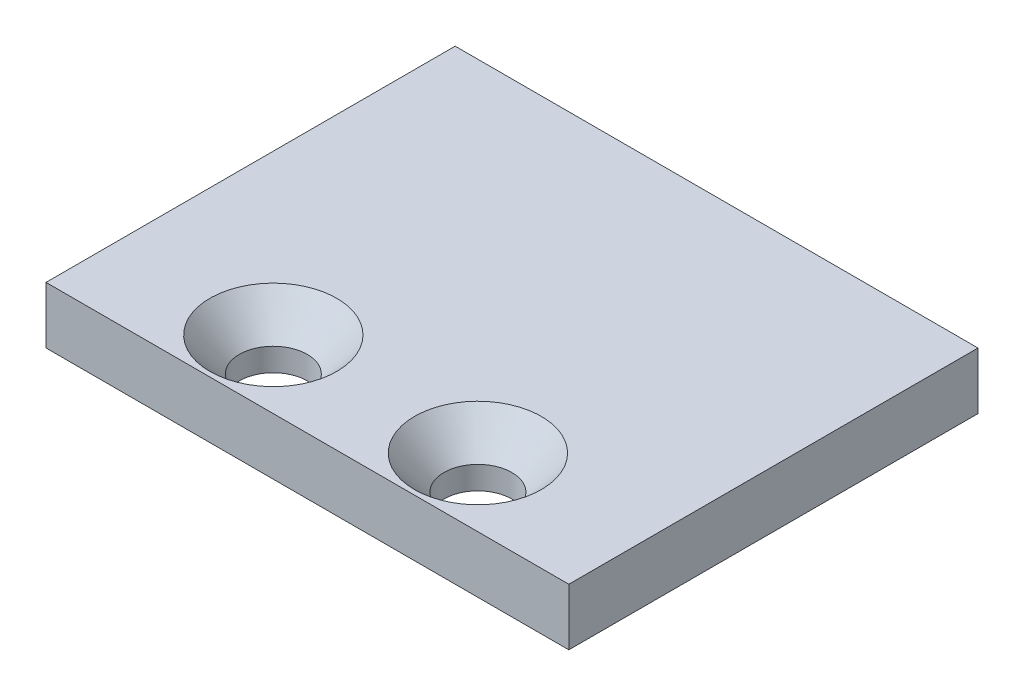
ISO-10303-21;
HEADER;
FILE_DESCRIPTION(('STEP AP214'),'2;1');
FILE_NAME('part.step','',(''),(''),'','','');
FILE_SCHEMA(('AUTOMOTIVE_DESIGN { 1 0 10303 214 1 1 1 1 }'));
ENDSEC;
DATA;
#1=APPLICATION_CONTEXT('core data for automotive mechanical design processes');
#2=APPLICATION_PROTOCOL_DEFINITION('international standard','automotive_design',2000,#1);
#3=PRODUCT_CONTEXT('',#1,'mechanical');
#4=PRODUCT('Part','Part','',(#3));
#5=PRODUCT_RELATED_PRODUCT_CATEGORY('part','',(#4));
#6=PRODUCT_DEFINITION_FORMATION('','',#4);
#7=PRODUCT_DEFINITION_CONTEXT('part definition',#1,'design');
#8=PRODUCT_DEFINITION('design','',#6,#7);
#9=PRODUCT_DEFINITION_SHAPE('','',#8);
#10=(LENGTH_UNIT() NAMED_UNIT(*) SI_UNIT(.MILLI.,.METRE.));
#11=(NAMED_UNIT(*) PLANE_ANGLE_UNIT() SI_UNIT($,.RADIAN.));
#12=(NAMED_UNIT(*) SI_UNIT($,.STERADIAN.) SOLID_ANGLE_UNIT());
#13=UNCERTAINTY_MEASURE_WITH_UNIT(LENGTH_MEASURE(1.E-05),#10,'distance_accuracy_value','');
#14=(GEOMETRIC_REPRESENTATION_CONTEXT(3) GLOBAL_UNCERTAINTY_ASSIGNED_CONTEXT((#13)) GLOBAL_UNIT_ASSIGNED_CONTEXT((#10,
#11,#12)) REPRESENTATION_CONTEXT('',''));
#15=CARTESIAN_POINT('',(0.,0.,0.));
#16=DIRECTION('',(0.,0.,1.));
#17=DIRECTION('',(1.,0.,0.));
#18=AXIS2_PLACEMENT_3D('',#15,#16,#17);
#19=CARTESIAN_POINT('',(14.605,3.175,11.43));
#20=DIRECTION('',(-1.,0.,0.));
#21=DIRECTION('',(0.,0.,1.));
#22=AXIS2_PLACEMENT_3D('',#19,#20,#21);
#23=PLANE('',#22);
#24=DIRECTION('',(0.,0.,-1.));
#25=VECTOR('',#24,1.);
#26=CARTESIAN_POINT('',(14.605,0.,11.43));
#27=LINE('',#26,#25);
#28=CARTESIAN_POINT('',(14.605,0.,11.43));
#29=VERTEX_POINT('',#28);
#30=CARTESIAN_POINT('',(14.605,0.,-11.43));
#31=VERTEX_POINT('',#30);
#32=EDGE_CURVE('E107',#29,#31,#27,.T.);
#33=ORIENTED_EDGE('',*,*,#32,.T.);
#34=DIRECTION('',(0.,-1.,0.));
#35=VECTOR('',#34,1.);
#36=CARTESIAN_POINT('',(14.605,3.175,-11.43));
#37=LINE('',#36,#35);
#38=CARTESIAN_POINT('',(14.605,3.175,-11.43));
#39=VERTEX_POINT('',#38);
#40=EDGE_CURVE('E11',#39,#31,#37,.T.);
#41=ORIENTED_EDGE('',*,*,#40,.F.);
#42=DIRECTION('',(0.,0.,-1.));
#43=VECTOR('',#42,1.);
#44=CARTESIAN_POINT('',(14.605,3.175,11.43));
#45=LINE('',#44,#43);
#46=CARTESIAN_POINT('',(14.605,3.175,11.43));
#47=VERTEX_POINT('',#46);
#48=EDGE_CURVE('E91',#47,#39,#45,.T.);
#49=ORIENTED_EDGE('',*,*,#48,.F.);
#50=DIRECTION('',(0.,-1.,0.));
#51=VECTOR('',#50,1.);
#52=CARTESIAN_POINT('',(14.605,3.175,11.43));
#53=LINE('',#52,#51);
#54=EDGE_CURVE('E103',#47,#29,#53,.T.);
#55=ORIENTED_EDGE('',*,*,#54,.T.);
#56=EDGE_LOOP('',(#33,#41,#49,#55));
#57=FACE_BOUND('',#56,.T.);
#58=ADVANCED_FACE('F39',(#57),#23,.F.);
#59=CARTESIAN_POINT('',(-14.605,3.175,-11.43));
#60=DIRECTION('',(0.,0.,1.));
#61=DIRECTION('',(1.,0.,0.));
#62=AXIS2_PLACEMENT_3D('',#59,#60,#61);
#63=PLANE('',#62);
#64=DIRECTION('',(-1.,0.,0.));
#65=VECTOR('',#64,1.);
#66=CARTESIAN_POINT('',(-14.605,0.,-11.43));
#67=LINE('',#66,#65);
#68=CARTESIAN_POINT('',(-14.605,0.,-11.43));
#69=VERTEX_POINT('',#68);
#70=EDGE_CURVE('E96',#31,#69,#67,.T.);
#71=ORIENTED_EDGE('',*,*,#70,.T.);
#72=DIRECTION('',(0.,-1.,0.));
#73=VECTOR('',#72,1.);
#74=CARTESIAN_POINT('',(-14.605,3.175,-11.43));
#75=LINE('',#74,#73);
#76=CARTESIAN_POINT('',(-14.605,3.175,-11.43));
#77=VERTEX_POINT('',#76);
#78=EDGE_CURVE('E48',#77,#69,#75,.T.);
#79=ORIENTED_EDGE('',*,*,#78,.F.);
#80=DIRECTION('',(-1.,0.,0.));
#81=VECTOR('',#80,1.);
#82=CARTESIAN_POINT('',(-14.605,3.175,-11.43));
#83=LINE('',#82,#81);
#84=EDGE_CURVE('E86',#39,#77,#83,.T.);
#85=ORIENTED_EDGE('',*,*,#84,.F.);
#86=ORIENTED_EDGE('',*,*,#40,.T.);
#87=EDGE_LOOP('',(#71,#79,#85,#86));
#88=FACE_BOUND('',#87,.T.);
#89=ADVANCED_FACE('F95',(#88),#63,.F.);
#90=CARTESIAN_POINT('',(-14.605,3.175,11.43));
#91=DIRECTION('',(1.,0.,0.));
#92=DIRECTION('',(0.,0.,-1.));
#93=AXIS2_PLACEMENT_3D('',#90,#91,#92);
#94=PLANE('',#93);
#95=DIRECTION('',(0.,0.,1.));
#96=VECTOR('',#95,1.);
#97=CARTESIAN_POINT('',(-14.605,0.,11.43));
#98=LINE('',#97,#96);
#99=CARTESIAN_POINT('',(-14.605,0.,11.43));
#100=VERTEX_POINT('',#99);
#101=EDGE_CURVE('E73',#69,#100,#98,.T.);
#102=ORIENTED_EDGE('',*,*,#101,.T.);
#103=DIRECTION('',(0.,-1.,0.));
#104=VECTOR('',#103,1.);
#105=CARTESIAN_POINT('',(-14.605,3.175,11.43));
#106=LINE('',#105,#104);
#107=CARTESIAN_POINT('',(-14.605,3.175,11.43));
#108=VERTEX_POINT('',#107);
#109=EDGE_CURVE('E98',#108,#100,#106,.T.);
#110=ORIENTED_EDGE('',*,*,#109,.F.);
#111=DIRECTION('',(0.,0.,1.));
#112=VECTOR('',#111,1.);
#113=CARTESIAN_POINT('',(-14.605,3.175,11.43));
#114=LINE('',#113,#112);
#115=EDGE_CURVE('E89',#77,#108,#114,.T.);
#116=ORIENTED_EDGE('',*,*,#115,.F.);
#117=ORIENTED_EDGE('',*,*,#78,.T.);
#118=EDGE_LOOP('',(#102,#110,#116,#117));
#119=FACE_BOUND('',#118,.T.);
#120=ADVANCED_FACE('F99',(#119),#94,.F.);
#121=CARTESIAN_POINT('',(-14.605,3.175,11.43));
#122=DIRECTION('',(0.,0.,-1.));
#123=DIRECTION('',(-1.,0.,0.));
#124=AXIS2_PLACEMENT_3D('',#121,#122,#123);
#125=PLANE('',#124);
#126=DIRECTION('',(1.,0.,0.));
#127=VECTOR('',#126,1.);
#128=CARTESIAN_POINT('',(-14.605,0.,11.43));
#129=LINE('',#128,#127);
#130=EDGE_CURVE('E79',#100,#29,#129,.T.);
#131=ORIENTED_EDGE('',*,*,#130,.T.);
#132=ORIENTED_EDGE('',*,*,#54,.F.);
#133=DIRECTION('',(1.,0.,0.));
#134=VECTOR('',#133,1.);
#135=CARTESIAN_POINT('',(-14.605,3.175,11.43));
#136=LINE('',#135,#134);
#137=EDGE_CURVE('E56',#108,#47,#136,.T.);
#138=ORIENTED_EDGE('',*,*,#137,.F.);
#139=ORIENTED_EDGE('',*,*,#109,.T.);
#140=EDGE_LOOP('',(#131,#132,#138,#139));
#141=FACE_BOUND('',#140,.T.);
#142=ADVANCED_FACE('F121',(#141),#125,.F.);
#143=CARTESIAN_POINT('',(0.,3.175,0.));
#144=DIRECTION('',(0.,-1.,0.));
#145=DIRECTION('',(0.,0.,-1.));
#146=AXIS2_PLACEMENT_3D('',#143,#144,#145);
#147=PLANE('',#146);
#148=CARTESIAN_POINT('',(-5.715,3.175,7.62));
#149=DIRECTION('',(0.,1.,0.));
#150=DIRECTION('',(0.,0.,1.));
#151=AXIS2_PLACEMENT_3D('',#148,#149,#150);
#152=CIRCLE('',#151,3.5433);
#153=CARTESIAN_POINT('',(-5.715,3.175,11.1633));
#154=VERTEX_POINT('',#153);
#155=EDGE_CURVE('E147',#154,#154,#152,.T.);
#156=ORIENTED_EDGE('',*,*,#155,.F.);
#157=EDGE_LOOP('',(#156));
#158=FACE_BOUND('',#157,.T.);
#159=CARTESIAN_POINT('',(5.71499999999999,3.175,7.62));
#160=DIRECTION('',(0.,1.,0.));
#161=DIRECTION('',(0.,0.,1.));
#162=AXIS2_PLACEMENT_3D('',#159,#160,#161);
#163=CIRCLE('',#162,3.5433);
#164=CARTESIAN_POINT('',(5.71499999999999,3.175,11.1633));
#165=VERTEX_POINT('',#164);
#166=EDGE_CURVE('E135',#165,#165,#163,.T.);
#167=ORIENTED_EDGE('',*,*,#166,.F.);
#168=EDGE_LOOP('',(#167));
#169=FACE_BOUND('',#168,.T.);
#170=ORIENTED_EDGE('',*,*,#48,.T.);
#171=ORIENTED_EDGE('',*,*,#84,.T.);
#172=ORIENTED_EDGE('',*,*,#115,.T.);
#173=ORIENTED_EDGE('',*,*,#137,.T.);
#174=EDGE_LOOP('',(#170,#171,#172,#173));
#175=FACE_BOUND('',#174,.T.);
#176=ADVANCED_FACE('F87',(#158,#169,#175),#147,.F.);
#177=CARTESIAN_POINT('',(0.,0.,0.));
#178=DIRECTION('',(0.,-1.,0.));
#179=DIRECTION('',(0.,0.,-1.));
#180=AXIS2_PLACEMENT_3D('',#177,#178,#179);
#181=PLANE('',#180);
#182=CARTESIAN_POINT('',(-5.715,0.,7.62));
#183=DIRECTION('',(0.,1.,0.));
#184=DIRECTION('',(0.,0.,1.));
#185=AXIS2_PLACEMENT_3D('',#182,#183,#184);
#186=CIRCLE('',#185,1.89865);
#187=CARTESIAN_POINT('',(-5.715,0.,9.51865));
#188=VERTEX_POINT('',#187);
#189=EDGE_CURVE('E139',#188,#188,#186,.T.);
#190=ORIENTED_EDGE('',*,*,#189,.T.);
#191=EDGE_LOOP('',(#190));
#192=FACE_BOUND('',#191,.T.);
#193=CARTESIAN_POINT('',(5.71499999999999,0.,7.62));
#194=DIRECTION('',(0.,1.,0.));
#195=DIRECTION('',(0.,0.,1.));
#196=AXIS2_PLACEMENT_3D('',#193,#194,#195);
#197=CIRCLE('',#196,1.89865);
#198=CARTESIAN_POINT('',(5.71499999999999,0.,9.51865));
#199=VERTEX_POINT('',#198);
#200=EDGE_CURVE('E111',#199,#199,#197,.T.);
#201=ORIENTED_EDGE('',*,*,#200,.T.);
#202=EDGE_LOOP('',(#201));
#203=FACE_BOUND('',#202,.T.);
#204=ORIENTED_EDGE('',*,*,#32,.F.);
#205=ORIENTED_EDGE('',*,*,#130,.F.);
#206=ORIENTED_EDGE('',*,*,#101,.F.);
#207=ORIENTED_EDGE('',*,*,#70,.F.);
#208=EDGE_LOOP('',(#204,#205,#206,#207));
#209=FACE_BOUND('',#208,.T.);
#210=ADVANCED_FACE('F124',(#192,#203,#209),#181,.T.);
#211=CARTESIAN_POINT('',(5.71499999999999,3.175,7.62));
#212=DIRECTION('',(0.,1.,0.));
#213=DIRECTION('',(0.,0.,1.));
#214=AXIS2_PLACEMENT_3D('',#211,#212,#213);
#215=CYLINDRICAL_SURFACE('',#214,1.89865);
#216=ORIENTED_EDGE('',*,*,#200,.F.);
#217=EDGE_LOOP('',(#216));
#218=FACE_BOUND('',#217,.T.);
#219=CARTESIAN_POINT('',(5.71499999999999,1.28304659906396,7.62));
#220=DIRECTION('',(0.,1.,0.));
#221=DIRECTION('',(0.,0.,1.));
#222=AXIS2_PLACEMENT_3D('',#219,#220,#221);
#223=CIRCLE('',#222,1.89865);
#224=CARTESIAN_POINT('',(5.71499999999999,1.28304659906396,9.51865));
#225=VERTEX_POINT('',#224);
#226=EDGE_CURVE('E131',#225,#225,#223,.T.);
#227=ORIENTED_EDGE('',*,*,#226,.T.);
#228=EDGE_LOOP('',(#227));
#229=FACE_BOUND('',#228,.T.);
#230=ADVANCED_FACE('F162',(#218,#229),#215,.F.);
#231=CARTESIAN_POINT('',(5.71499999999999,3.175,7.62));
#232=DIRECTION('',(0.,1.,0.));
#233=DIRECTION('',(0.,0.,1.));
#234=AXIS2_PLACEMENT_3D('',#231,#232,#233);
#235=CONICAL_SURFACE('',#234,3.5433,0.715584993317674);
#236=ORIENTED_EDGE('',*,*,#226,.F.);
#237=EDGE_LOOP('',(#236));
#238=FACE_BOUND('',#237,.T.);
#239=ORIENTED_EDGE('',*,*,#166,.T.);
#240=EDGE_LOOP('',(#239));
#241=FACE_BOUND('',#240,.T.);
#242=ADVANCED_FACE('F159',(#238,#241),#235,.F.);
#243=CARTESIAN_POINT('',(-5.715,3.175,7.62));
#244=DIRECTION('',(0.,1.,0.));
#245=DIRECTION('',(0.,0.,1.));
#246=AXIS2_PLACEMENT_3D('',#243,#244,#245);
#247=CYLINDRICAL_SURFACE('',#246,1.89865);
#248=ORIENTED_EDGE('',*,*,#189,.F.);
#249=EDGE_LOOP('',(#248));
#250=FACE_BOUND('',#249,.T.);
#251=CARTESIAN_POINT('',(-5.715,1.28304659906396,7.62));
#252=DIRECTION('',(0.,1.,0.));
#253=DIRECTION('',(0.,0.,1.));
#254=AXIS2_PLACEMENT_3D('',#251,#252,#253);
#255=CIRCLE('',#254,1.89865);
#256=CARTESIAN_POINT('',(-5.715,1.28304659906396,9.51865));
#257=VERTEX_POINT('',#256);
#258=EDGE_CURVE('E143',#257,#257,#255,.T.);
#259=ORIENTED_EDGE('',*,*,#258,.T.);
#260=EDGE_LOOP('',(#259));
#261=FACE_BOUND('',#260,.T.);
#262=ADVANCED_FACE('F161',(#250,#261),#247,.F.);
#263=CARTESIAN_POINT('',(-5.715,3.175,7.62));
#264=DIRECTION('',(0.,1.,0.));
#265=DIRECTION('',(0.,0.,1.));
#266=AXIS2_PLACEMENT_3D('',#263,#264,#265);
#267=CONICAL_SURFACE('',#266,3.5433,0.715584993317674);
#268=ORIENTED_EDGE('',*,*,#258,.F.);
#269=EDGE_LOOP('',(#268));
#270=FACE_BOUND('',#269,.T.);
#271=ORIENTED_EDGE('',*,*,#155,.T.);
#272=EDGE_LOOP('',(#271));
#273=FACE_BOUND('',#272,.T.);
#274=ADVANCED_FACE('F152',(#270,#273),#267,.F.);
#275=CLOSED_SHELL('',(#58,#89,#120,#142,#176,#210,#230,#242,#262,#274));
#276=MANIFOLD_SOLID_BREP('B2',#275);
#277=ADVANCED_BREP_SHAPE_REPRESENTATION('',(#18,#276),#14);
#278=SHAPE_DEFINITION_REPRESENTATION(#9,#277);
ENDSEC;
END-ISO-10303-21;
